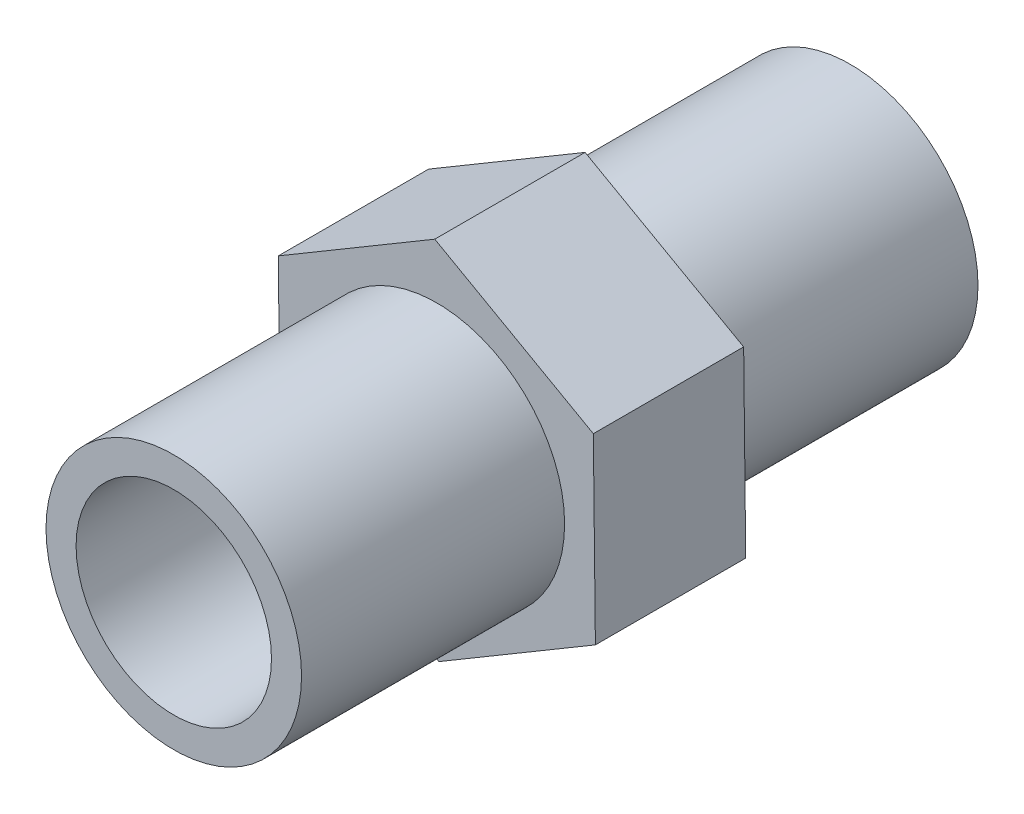
ISO-10303-21;
HEADER;
FILE_DESCRIPTION(('STEP AP214'),'2;1');
FILE_NAME('part.step','',(''),(''),'','','');
FILE_SCHEMA(('AUTOMOTIVE_DESIGN { 1 0 10303 214 1 1 1 1 }'));
ENDSEC;
DATA;
#1=APPLICATION_CONTEXT('core data for automotive mechanical design processes');
#2=APPLICATION_PROTOCOL_DEFINITION('international standard','automotive_design',2000,#1);
#3=PRODUCT_CONTEXT('',#1,'mechanical');
#4=PRODUCT('Part','Part','',(#3));
#5=PRODUCT_RELATED_PRODUCT_CATEGORY('part','',(#4));
#6=PRODUCT_DEFINITION_FORMATION('','',#4);
#7=PRODUCT_DEFINITION_CONTEXT('part definition',#1,'design');
#8=PRODUCT_DEFINITION('design','',#6,#7);
#9=PRODUCT_DEFINITION_SHAPE('','',#8);
#10=(LENGTH_UNIT() NAMED_UNIT(*) SI_UNIT(.MILLI.,.METRE.));
#11=(NAMED_UNIT(*) PLANE_ANGLE_UNIT() SI_UNIT($,.RADIAN.));
#12=(NAMED_UNIT(*) SI_UNIT($,.STERADIAN.) SOLID_ANGLE_UNIT());
#13=UNCERTAINTY_MEASURE_WITH_UNIT(LENGTH_MEASURE(1.E-05),#10,'distance_accuracy_value','');
#14=(GEOMETRIC_REPRESENTATION_CONTEXT(3) GLOBAL_UNCERTAINTY_ASSIGNED_CONTEXT((#13)) GLOBAL_UNIT_ASSIGNED_CONTEXT((#10,
#11,#12)) REPRESENTATION_CONTEXT('',''));
#15=CARTESIAN_POINT('',(0.,0.,0.));
#16=DIRECTION('',(0.,0.,1.));
#17=DIRECTION('',(1.,0.,0.));
#18=AXIS2_PLACEMENT_3D('',#15,#16,#17);
#19=CARTESIAN_POINT('',(-8.88178419700125E-13,0.,22.5));
#20=DIRECTION('',(0.,0.,1.));
#21=DIRECTION('',(1.,0.,0.));
#22=AXIS2_PLACEMENT_3D('',#19,#20,#21);
#23=PLANE('',#22);
#24=CARTESIAN_POINT('',(-8.88178419700125E-13,0.,22.5));
#25=DIRECTION('',(0.,0.,1.));
#26=DIRECTION('',(1.,0.,0.));
#27=AXIS2_PLACEMENT_3D('',#24,#25,#26);
#28=CIRCLE('',#27,8.5);
#29=CARTESIAN_POINT('',(-8.50000000000089,0.,22.5));
#30=VERTEX_POINT('',#29);
#31=EDGE_CURVE('E155',#30,#30,#28,.T.);
#32=ORIENTED_EDGE('',*,*,#31,.T.);
#33=EDGE_LOOP('',(#32));
#34=FACE_BOUND('',#33,.T.);
#35=CARTESIAN_POINT('',(-8.88178419700125E-13,0.,22.5));
#36=DIRECTION('',(0.,0.,1.));
#37=DIRECTION('',(1.,0.,0.));
#38=AXIS2_PLACEMENT_3D('',#35,#36,#37);
#39=CIRCLE('',#38,6.5);
#40=CARTESIAN_POINT('',(-6.50000000000089,0.,22.5));
#41=VERTEX_POINT('',#40);
#42=EDGE_CURVE('E149',#41,#41,#39,.T.);
#43=ORIENTED_EDGE('',*,*,#42,.F.);
#44=EDGE_LOOP('',(#43));
#45=FACE_BOUND('',#44,.T.);
#46=ADVANCED_FACE('F38',(#34,#45),#23,.T.);
#47=CARTESIAN_POINT('',(-8.88178419700125E-13,0.,22.5));
#48=DIRECTION('',(0.,0.,-1.));
#49=DIRECTION('',(-1.,0.,0.));
#50=AXIS2_PLACEMENT_3D('',#47,#48,#49);
#51=CYLINDRICAL_SURFACE('',#50,8.5);
#52=CARTESIAN_POINT('',(8.88178419700125E-13,0.,4.99999999999989));
#53=DIRECTION('',(0.,0.,1.));
#54=DIRECTION('',(1.,0.,0.));
#55=AXIS2_PLACEMENT_3D('',#52,#53,#54);
#56=CIRCLE('',#55,8.5);
#57=CARTESIAN_POINT('',(-8.50000000000089,0.,4.99999999999989));
#58=VERTEX_POINT('',#57);
#59=EDGE_CURVE('E145',#58,#58,#56,.T.);
#60=CARTESIAN_POINT('',(-8.50000000000089,0.,4.99999999999989));
#61=CARTESIAN_POINT('',(-8.50000000000089,0.,5.18229166666656));
#62=CARTESIAN_POINT('',(-8.50000000000089,0.,5.36458333333322));
#63=CARTESIAN_POINT('',(-8.50000000000089,0.,5.72916666666656));
#64=CARTESIAN_POINT('',(-8.50000000000089,0.,5.91145833333323));
#65=CARTESIAN_POINT('',(-8.50000000000089,0.,6.27604166666656));
#66=CARTESIAN_POINT('',(-8.50000000000089,0.,6.45833333333323));
#67=CARTESIAN_POINT('',(-8.50000000000089,0.,6.82291666666656));
#68=CARTESIAN_POINT('',(-8.50000000000089,0.,7.00520833333323));
#69=CARTESIAN_POINT('',(-8.50000000000089,0.,7.36979166666656));
#70=CARTESIAN_POINT('',(-8.50000000000089,0.,7.55208333333323));
#71=CARTESIAN_POINT('',(-8.50000000000089,0.,7.91666666666657));
#72=CARTESIAN_POINT('',(-8.50000000000089,0.,8.09895833333324));
#73=CARTESIAN_POINT('',(-8.50000000000089,0.,8.46354166666657));
#74=CARTESIAN_POINT('',(-8.50000000000089,0.,8.64583333333324));
#75=CARTESIAN_POINT('',(-8.50000000000089,0.,9.01041666666657));
#76=CARTESIAN_POINT('',(-8.50000000000089,0.,9.19270833333324));
#77=CARTESIAN_POINT('',(-8.50000000000089,0.,9.55729166666658));
#78=CARTESIAN_POINT('',(-8.50000000000089,0.,9.73958333333324));
#79=CARTESIAN_POINT('',(-8.50000000000089,0.,10.1041666666666));
#80=CARTESIAN_POINT('',(-8.50000000000089,0.,10.2864583333332));
#81=CARTESIAN_POINT('',(-8.50000000000089,0.,10.6510416666666));
#82=CARTESIAN_POINT('',(-8.50000000000089,0.,10.8333333333332));
#83=CARTESIAN_POINT('',(-8.50000000000089,0.,11.1979166666666));
#84=CARTESIAN_POINT('',(-8.50000000000089,0.,11.3802083333333));
#85=CARTESIAN_POINT('',(-8.50000000000089,0.,11.7447916666666));
#86=CARTESIAN_POINT('',(-8.50000000000089,0.,11.9270833333333));
#87=CARTESIAN_POINT('',(-8.50000000000089,0.,12.2916666666666));
#88=CARTESIAN_POINT('',(-8.50000000000089,0.,12.4739583333333));
#89=CARTESIAN_POINT('',(-8.50000000000089,0.,12.8385416666666));
#90=CARTESIAN_POINT('',(-8.50000000000089,0.,13.0208333333333));
#91=CARTESIAN_POINT('',(-8.50000000000089,0.,13.3854166666666));
#92=CARTESIAN_POINT('',(-8.50000000000089,0.,13.5677083333333));
#93=CARTESIAN_POINT('',(-8.50000000000089,0.,13.9322916666666));
#94=CARTESIAN_POINT('',(-8.50000000000089,0.,14.1145833333333));
#95=CARTESIAN_POINT('',(-8.50000000000089,0.,14.4791666666666));
#96=CARTESIAN_POINT('',(-8.50000000000089,0.,14.6614583333333));
#97=CARTESIAN_POINT('',(-8.50000000000089,0.,15.0260416666666));
#98=CARTESIAN_POINT('',(-8.50000000000089,0.,15.2083333333333));
#99=CARTESIAN_POINT('',(-8.50000000000089,0.,15.5729166666666));
#100=CARTESIAN_POINT('',(-8.50000000000089,0.,15.7552083333333));
#101=CARTESIAN_POINT('',(-8.50000000000089,0.,16.1197916666666));
#102=CARTESIAN_POINT('',(-8.50000000000089,0.,16.3020833333333));
#103=CARTESIAN_POINT('',(-8.50000000000089,0.,16.6666666666666));
#104=CARTESIAN_POINT('',(-8.50000000000089,0.,16.8489583333333));
#105=CARTESIAN_POINT('',(-8.50000000000089,0.,17.2135416666666));
#106=CARTESIAN_POINT('',(-8.50000000000089,0.,17.3958333333333));
#107=CARTESIAN_POINT('',(-8.50000000000089,0.,17.7604166666666));
#108=CARTESIAN_POINT('',(-8.50000000000089,0.,17.9427083333333));
#109=CARTESIAN_POINT('',(-8.50000000000089,0.,18.3072916666666));
#110=CARTESIAN_POINT('',(-8.50000000000089,0.,18.4895833333333));
#111=CARTESIAN_POINT('',(-8.50000000000089,0.,18.8541666666666));
#112=CARTESIAN_POINT('',(-8.50000000000089,0.,19.0364583333333));
#113=CARTESIAN_POINT('',(-8.50000000000089,0.,19.4010416666666));
#114=CARTESIAN_POINT('',(-8.50000000000089,0.,19.5833333333333));
#115=CARTESIAN_POINT('',(-8.50000000000089,0.,19.9479166666666));
#116=CARTESIAN_POINT('',(-8.50000000000089,0.,20.1302083333333));
#117=CARTESIAN_POINT('',(-8.50000000000089,0.,20.4947916666666));
#118=CARTESIAN_POINT('',(-8.50000000000089,0.,20.6770833333333));
#119=CARTESIAN_POINT('',(-8.50000000000089,0.,21.0416666666666));
#120=CARTESIAN_POINT('',(-8.50000000000089,0.,21.2239583333333));
#121=CARTESIAN_POINT('',(-8.50000000000089,0.,21.5885416666666));
#122=CARTESIAN_POINT('',(-8.50000000000089,0.,21.7708333333333));
#123=CARTESIAN_POINT('',(-8.50000000000089,0.,22.1354166666666));
#124=CARTESIAN_POINT('',(-8.50000000000089,0.,22.3177083333333));
#125=CARTESIAN_POINT('',(-8.50000000000089,0.,22.5));
#126=B_SPLINE_CURVE_WITH_KNOTS('',3,(#60,#61,#62,#63,#64,#65,#66,#67,#68,#69,#70,#71,#72,#73,
#74,#75,#76,#77,#78,#79,#80,#81,#82,#83,#84,#85,#86,#87,#88,#89,#90,#91,#92,#93,#94,#95,#96,#97,
#98,#99,#100,#101,#102,#103,#104,#105,#106,#107,#108,#109,#110,#111,#112,#113,#114,#115,#116,
#117,#118,#119,#120,#121,#122,#123,#124,#125),.UNSPECIFIED.,.F.,.F.,(4,2,2,2,2,2,2,2,2,2,2,2,2,
2,2,2,2,2,2,2,2,2,2,2,2,2,2,2,2,2,2,2,4),(0.,0.546875000000002,1.09375,1.64062500000001,
2.18750000000001,2.73437500000001,3.28125000000001,3.82812500000002,4.37500000000002,
4.92187500000002,5.46875000000002,6.01562500000003,6.56250000000003,7.10937500000003,
7.65625000000003,8.20312500000004,8.75000000000004,9.29687500000004,9.84375000000004,10.390625,
10.9375,11.484375,12.0312500000001,12.5781250000001,13.1250000000001,13.6718750000001,
14.2187500000001,14.7656250000001,15.3125000000001,15.8593750000001,16.4062500000001,
16.9531250000001,17.5000000000001),.UNSPECIFIED.);
#127=EDGE_CURVE('BSEAM40',#58,#30,#126,.T.);
#128=ORIENTED_EDGE('',*,*,#59,.T.);
#129=ORIENTED_EDGE('',*,*,#31,.F.);
#130=ORIENTED_EDGE('',*,*,#127,.T.);
#131=ORIENTED_EDGE('',*,*,#127,.F.);
#132=EDGE_LOOP('',(#128,#130,#129,#131));
#133=FACE_BOUND('',#132,.T.);
#134=ADVANCED_FACE('F40',(#133),#51,.T.);
#135=CARTESIAN_POINT('',(-8.88178419700125E-13,0.,22.5));
#136=DIRECTION('',(0.,0.,-1.));
#137=DIRECTION('',(-1.,0.,0.));
#138=AXIS2_PLACEMENT_3D('',#135,#136,#137);
#139=CYLINDRICAL_SURFACE('',#138,6.5);
#140=CARTESIAN_POINT('',(8.88178419700125E-13,0.,4.99999999999989));
#141=DIRECTION('',(0.,0.,1.));
#142=DIRECTION('',(1.,0.,0.));
#143=AXIS2_PLACEMENT_3D('',#140,#141,#142);
#144=CIRCLE('',#143,6.5);
#145=CARTESIAN_POINT('',(-6.50000000000089,0.,4.99999999999989));
#146=VERTEX_POINT('',#145);
#147=EDGE_CURVE('E42',#146,#146,#144,.T.);
#148=CARTESIAN_POINT('',(-6.50000000000089,0.,4.99999999999989));
#149=CARTESIAN_POINT('',(-6.50000000000089,0.,5.18229166666656));
#150=CARTESIAN_POINT('',(-6.50000000000089,0.,5.36458333333322));
#151=CARTESIAN_POINT('',(-6.50000000000089,0.,5.72916666666656));
#152=CARTESIAN_POINT('',(-6.50000000000089,0.,5.91145833333323));
#153=CARTESIAN_POINT('',(-6.50000000000089,0.,6.27604166666656));
#154=CARTESIAN_POINT('',(-6.50000000000089,0.,6.45833333333323));
#155=CARTESIAN_POINT('',(-6.50000000000089,0.,6.82291666666656));
#156=CARTESIAN_POINT('',(-6.50000000000089,0.,7.00520833333323));
#157=CARTESIAN_POINT('',(-6.50000000000089,0.,7.36979166666656));
#158=CARTESIAN_POINT('',(-6.50000000000089,0.,7.55208333333323));
#159=CARTESIAN_POINT('',(-6.50000000000089,0.,7.91666666666657));
#160=CARTESIAN_POINT('',(-6.50000000000089,0.,8.09895833333324));
#161=CARTESIAN_POINT('',(-6.50000000000089,0.,8.46354166666657));
#162=CARTESIAN_POINT('',(-6.50000000000089,0.,8.64583333333324));
#163=CARTESIAN_POINT('',(-6.50000000000089,0.,9.01041666666657));
#164=CARTESIAN_POINT('',(-6.50000000000089,0.,9.19270833333324));
#165=CARTESIAN_POINT('',(-6.50000000000089,0.,9.55729166666658));
#166=CARTESIAN_POINT('',(-6.50000000000089,0.,9.73958333333324));
#167=CARTESIAN_POINT('',(-6.50000000000089,0.,10.1041666666666));
#168=CARTESIAN_POINT('',(-6.50000000000089,0.,10.2864583333332));
#169=CARTESIAN_POINT('',(-6.50000000000089,0.,10.6510416666666));
#170=CARTESIAN_POINT('',(-6.50000000000089,0.,10.8333333333332));
#171=CARTESIAN_POINT('',(-6.50000000000089,0.,11.1979166666666));
#172=CARTESIAN_POINT('',(-6.50000000000089,0.,11.3802083333333));
#173=CARTESIAN_POINT('',(-6.50000000000089,0.,11.7447916666666));
#174=CARTESIAN_POINT('',(-6.50000000000089,0.,11.9270833333333));
#175=CARTESIAN_POINT('',(-6.50000000000089,0.,12.2916666666666));
#176=CARTESIAN_POINT('',(-6.50000000000089,0.,12.4739583333333));
#177=CARTESIAN_POINT('',(-6.50000000000089,0.,12.8385416666666));
#178=CARTESIAN_POINT('',(-6.50000000000089,0.,13.0208333333333));
#179=CARTESIAN_POINT('',(-6.50000000000089,0.,13.3854166666666));
#180=CARTESIAN_POINT('',(-6.50000000000089,0.,13.5677083333333));
#181=CARTESIAN_POINT('',(-6.50000000000089,0.,13.9322916666666));
#182=CARTESIAN_POINT('',(-6.50000000000089,0.,14.1145833333333));
#183=CARTESIAN_POINT('',(-6.50000000000089,0.,14.4791666666666));
#184=CARTESIAN_POINT('',(-6.50000000000089,0.,14.6614583333333));
#185=CARTESIAN_POINT('',(-6.50000000000089,0.,15.0260416666666));
#186=CARTESIAN_POINT('',(-6.50000000000089,0.,15.2083333333333));
#187=CARTESIAN_POINT('',(-6.50000000000089,0.,15.5729166666666));
#188=CARTESIAN_POINT('',(-6.50000000000089,0.,15.7552083333333));
#189=CARTESIAN_POINT('',(-6.50000000000089,0.,16.1197916666666));
#190=CARTESIAN_POINT('',(-6.50000000000089,0.,16.3020833333333));
#191=CARTESIAN_POINT('',(-6.50000000000089,0.,16.6666666666666));
#192=CARTESIAN_POINT('',(-6.50000000000089,0.,16.8489583333333));
#193=CARTESIAN_POINT('',(-6.50000000000089,0.,17.2135416666666));
#194=CARTESIAN_POINT('',(-6.50000000000089,0.,17.3958333333333));
#195=CARTESIAN_POINT('',(-6.50000000000089,0.,17.7604166666666));
#196=CARTESIAN_POINT('',(-6.50000000000089,0.,17.9427083333333));
#197=CARTESIAN_POINT('',(-6.50000000000089,0.,18.3072916666666));
#198=CARTESIAN_POINT('',(-6.50000000000089,0.,18.4895833333333));
#199=CARTESIAN_POINT('',(-6.50000000000089,0.,18.8541666666666));
#200=CARTESIAN_POINT('',(-6.50000000000089,0.,19.0364583333333));
#201=CARTESIAN_POINT('',(-6.50000000000089,0.,19.4010416666666));
#202=CARTESIAN_POINT('',(-6.50000000000089,0.,19.5833333333333));
#203=CARTESIAN_POINT('',(-6.50000000000089,0.,19.9479166666666));
#204=CARTESIAN_POINT('',(-6.50000000000089,0.,20.1302083333333));
#205=CARTESIAN_POINT('',(-6.50000000000089,0.,20.4947916666666));
#206=CARTESIAN_POINT('',(-6.50000000000089,0.,20.6770833333333));
#207=CARTESIAN_POINT('',(-6.50000000000089,0.,21.0416666666666));
#208=CARTESIAN_POINT('',(-6.50000000000089,0.,21.2239583333333));
#209=CARTESIAN_POINT('',(-6.50000000000089,0.,21.5885416666666));
#210=CARTESIAN_POINT('',(-6.50000000000089,0.,21.7708333333333));
#211=CARTESIAN_POINT('',(-6.50000000000089,0.,22.1354166666666));
#212=CARTESIAN_POINT('',(-6.50000000000089,0.,22.3177083333333));
#213=CARTESIAN_POINT('',(-6.50000000000089,0.,22.5));
#214=B_SPLINE_CURVE_WITH_KNOTS('',3,(#148,#149,#150,#151,#152,#153,#154,#155,#156,#157,#158,
#159,#160,#161,#162,#163,#164,#165,#166,#167,#168,#169,#170,#171,#172,#173,#174,#175,#176,#177,
#178,#179,#180,#181,#182,#183,#184,#185,#186,#187,#188,#189,#190,#191,#192,#193,#194,#195,#196,
#197,#198,#199,#200,#201,#202,#203,#204,#205,#206,#207,#208,#209,#210,#211,#212,#213),
.UNSPECIFIED.,.F.,.F.,(4,2,2,2,2,2,2,2,2,2,2,2,2,2,2,2,2,2,2,2,2,2,2,2,2,2,2,2,2,2,2,2,4),(0.,
0.546875000000002,1.09375,1.64062500000001,2.18750000000001,2.73437500000001,3.28125000000001,
3.82812500000002,4.37500000000002,4.92187500000002,5.46875000000002,6.01562500000003,
6.56250000000003,7.10937500000003,7.65625000000003,8.20312500000004,8.75000000000004,
9.29687500000004,9.84375000000004,10.390625,10.9375,11.484375,12.0312500000001,12.5781250000001,
13.1250000000001,13.6718750000001,14.2187500000001,14.7656250000001,15.3125000000001,
15.8593750000001,16.4062500000001,16.9531250000001,17.5000000000001),.UNSPECIFIED.);
#215=EDGE_CURVE('BSEAM174',#146,#41,#214,.T.);
#216=ORIENTED_EDGE('',*,*,#147,.F.);
#217=ORIENTED_EDGE('',*,*,#42,.T.);
#218=ORIENTED_EDGE('',*,*,#215,.T.);
#219=ORIENTED_EDGE('',*,*,#215,.F.);
#220=EDGE_LOOP('',(#216,#218,#217,#219));
#221=FACE_BOUND('',#220,.T.);
#222=ADVANCED_FACE('F174',(#221),#139,.F.);
#223=CARTESIAN_POINT('',(8.88178419700125E-13,0.,4.99999999999989));
#224=DIRECTION('',(0.,0.,1.));
#225=DIRECTION('',(1.,0.,0.));
#226=AXIS2_PLACEMENT_3D('',#223,#224,#225);
#227=PLANE('',#226);
#228=ORIENTED_EDGE('',*,*,#147,.T.);
#229=EDGE_LOOP('',(#228));
#230=FACE_BOUND('',#229,.T.);
#231=ADVANCED_FACE('F214',(#230),#227,.T.);
#232=CARTESIAN_POINT('',(10.5475883351422,-5.93199806031164,4.99999999999989));
#233=DIRECTION('',(-0.999936349812819,-0.0112825672174558,0.));
#234=DIRECTION('',(0.0112825672174556,-0.999936349812819,0.));
#235=AXIS2_PLACEMENT_3D('',#232,#233,#234);
#236=PLANE('',#235);
#237=DIRECTION('',(-0.0112825672174556,0.999936349812819,0.));
#238=VECTOR('',#237,1.);
#239=CARTESIAN_POINT('',(10.5475883351431,-5.93199806031161,-5.));
#240=LINE('',#239,#238);
#241=CARTESIAN_POINT('',(10.5475883351431,-5.93199806031161,-5.));
#242=VERTEX_POINT('',#241);
#243=CARTESIAN_POINT('',(10.4110551830017,6.16848041673723,-5.00000000000067));
#244=VERTEX_POINT('',#243);
#245=EDGE_CURVE('E125',#242,#244,#240,.T.);
#246=ORIENTED_EDGE('',*,*,#245,.T.);
#247=DIRECTION('',(0.,0.,-1.));
#248=VECTOR('',#247,1.);
#249=CARTESIAN_POINT('',(10.4110551830008,6.16848041673815,4.99999999999989));
#250=LINE('',#249,#248);
#251=CARTESIAN_POINT('',(10.4110551830008,6.16848041673815,4.99999999999989));
#252=VERTEX_POINT('',#251);
#253=EDGE_CURVE('E142',#252,#244,#250,.T.);
#254=ORIENTED_EDGE('',*,*,#253,.F.);
#255=DIRECTION('',(-0.0112825672174556,0.999936349812819,0.));
#256=VECTOR('',#255,1.);
#257=CARTESIAN_POINT('',(10.5475883351422,-5.93199806031164,4.99999999999989));
#258=LINE('',#257,#256);
#259=CARTESIAN_POINT('',(10.5475883351422,-5.93199806031164,4.99999999999989));
#260=VERTEX_POINT('',#259);
#261=EDGE_CURVE('E135',#260,#252,#258,.T.);
#262=ORIENTED_EDGE('',*,*,#261,.F.);
#263=DIRECTION('',(0.,0.,-1.));
#264=VECTOR('',#263,1.);
#265=CARTESIAN_POINT('',(10.5475883351422,-5.93199806031164,4.99999999999989));
#266=LINE('',#265,#264);
#267=EDGE_CURVE('E121',#260,#242,#266,.T.);
#268=ORIENTED_EDGE('',*,*,#267,.T.);
#269=EDGE_LOOP('',(#246,#254,#262,#268));
#270=FACE_BOUND('',#269,.T.);
#271=ADVANCED_FACE('F205',(#270),#236,.F.);
#272=CARTESIAN_POINT('',(10.4110551830008,6.16848041673815,4.99999999999989));
#273=DIRECTION('',(-0.490197185076187,-0.871611564714112,0.));
#274=DIRECTION('',(0.871611564714112,-0.490197185076188,0.));
#275=AXIS2_PLACEMENT_3D('',#272,#273,#274);
#276=PLANE('',#275);
#277=DIRECTION('',(-0.871611564714112,0.490197185076188,0.));
#278=VECTOR('',#277,1.);
#279=CARTESIAN_POINT('',(10.4110551830017,6.16848041673723,-5.00000000000067));
#280=LINE('',#279,#278);
#281=CARTESIAN_POINT('',(-0.136533152140572,12.1004784770489,-5.00000000000078));
#282=VERTEX_POINT('',#281);
#283=EDGE_CURVE('E128',#244,#282,#280,.T.);
#284=ORIENTED_EDGE('',*,*,#283,.T.);
#285=DIRECTION('',(0.,0.,-1.));
#286=VECTOR('',#285,1.);
#287=CARTESIAN_POINT('',(-0.13653315214146,12.1004784770489,4.99999999999989));
#288=LINE('',#287,#286);
#289=CARTESIAN_POINT('',(-0.13653315214146,12.1004784770489,4.99999999999989));
#290=VERTEX_POINT('',#289);
#291=EDGE_CURVE('E139',#290,#282,#288,.T.);
#292=ORIENTED_EDGE('',*,*,#291,.F.);
#293=DIRECTION('',(-0.871611564714112,0.490197185076188,0.));
#294=VECTOR('',#293,1.);
#295=CARTESIAN_POINT('',(10.4110551830008,6.16848041673815,4.99999999999989));
#296=LINE('',#295,#294);
#297=EDGE_CURVE('E94',#252,#290,#296,.T.);
#298=ORIENTED_EDGE('',*,*,#297,.F.);
#299=ORIENTED_EDGE('',*,*,#253,.T.);
#300=EDGE_LOOP('',(#284,#292,#298,#299));
#301=FACE_BOUND('',#300,.T.);
#302=ADVANCED_FACE('F222',(#301),#276,.F.);
#303=CARTESIAN_POINT('',(-0.13653315214146,12.1004784770489,4.99999999999989));
#304=DIRECTION('',(0.509739164736631,-0.860328997496657,0.));
#305=DIRECTION('',(0.860328997496656,0.509739164736632,0.));
#306=AXIS2_PLACEMENT_3D('',#303,#304,#305);
#307=PLANE('',#306);
#308=DIRECTION('',(-0.860328997496656,-0.509739164736632,0.));
#309=VECTOR('',#308,1.);
#310=CARTESIAN_POINT('',(-0.136533152140572,12.1004784770489,-5.00000000000078));
#311=LINE('',#310,#309);
#312=CARTESIAN_POINT('',(-10.5475883351431,5.93199806031164,-5.));
#313=VERTEX_POINT('',#312);
#314=EDGE_CURVE('E130',#282,#313,#311,.T.);
#315=ORIENTED_EDGE('',*,*,#314,.T.);
#316=DIRECTION('',(0.,0.,-1.));
#317=VECTOR('',#316,1.);
#318=CARTESIAN_POINT('',(-10.5475883351431,5.93199806031167,4.99999999999978));
#319=LINE('',#318,#317);
#320=CARTESIAN_POINT('',(-10.5475883351431,5.93199806031167,4.99999999999978));
#321=VERTEX_POINT('',#320);
#322=EDGE_CURVE('E116',#321,#313,#319,.T.);
#323=ORIENTED_EDGE('',*,*,#322,.F.);
#324=DIRECTION('',(-0.860328997496656,-0.509739164736632,0.));
#325=VECTOR('',#324,1.);
#326=CARTESIAN_POINT('',(-0.13653315214146,12.1004784770489,4.99999999999989));
#327=LINE('',#326,#325);
#328=EDGE_CURVE('E107',#290,#321,#327,.T.);
#329=ORIENTED_EDGE('',*,*,#328,.F.);
#330=ORIENTED_EDGE('',*,*,#291,.T.);
#331=EDGE_LOOP('',(#315,#323,#329,#330));
#332=FACE_BOUND('',#331,.T.);
#333=ADVANCED_FACE('F219',(#332),#307,.F.);
#334=CARTESIAN_POINT('',(-10.5475883351431,5.93199806031167,4.99999999999978));
#335=DIRECTION('',(0.999936349812819,0.0112825672174558,0.));
#336=DIRECTION('',(-0.0112825672174558,0.999936349812819,0.));
#337=AXIS2_PLACEMENT_3D('',#334,#335,#336);
#338=PLANE('',#337);
#339=DIRECTION('',(0.0112825672174558,-0.999936349812819,0.));
#340=VECTOR('',#339,1.);
#341=CARTESIAN_POINT('',(-10.5475883351431,5.93199806031164,-5.));
#342=LINE('',#341,#340);
#343=CARTESIAN_POINT('',(-10.4110551830017,-6.16848041673815,-5.00000000000078));
#344=VERTEX_POINT('',#343);
#345=EDGE_CURVE('E115',#313,#344,#342,.T.);
#346=ORIENTED_EDGE('',*,*,#345,.T.);
#347=DIRECTION('',(0.,0.,-1.));
#348=VECTOR('',#347,1.);
#349=CARTESIAN_POINT('',(-10.4110551830008,-6.16848041673818,4.99999999999901));
#350=LINE('',#349,#348);
#351=CARTESIAN_POINT('',(-10.4110551830008,-6.16848041673818,4.99999999999901));
#352=VERTEX_POINT('',#351);
#353=EDGE_CURVE('E112',#352,#344,#350,.T.);
#354=ORIENTED_EDGE('',*,*,#353,.F.);
#355=DIRECTION('',(0.0112825672174558,-0.999936349812819,0.));
#356=VECTOR('',#355,1.);
#357=CARTESIAN_POINT('',(-10.5475883351431,5.93199806031167,4.99999999999978));
#358=LINE('',#357,#356);
#359=EDGE_CURVE('E101',#321,#352,#358,.T.);
#360=ORIENTED_EDGE('',*,*,#359,.F.);
#361=ORIENTED_EDGE('',*,*,#322,.T.);
#362=EDGE_LOOP('',(#346,#354,#360,#361));
#363=FACE_BOUND('',#362,.T.);
#364=ADVANCED_FACE('F113',(#363),#338,.F.);
#365=CARTESIAN_POINT('',(-10.4110551830008,-6.16848041673818,4.99999999999901));
#366=DIRECTION('',(0.490197185076187,0.871611564714112,0.));
#367=DIRECTION('',(-0.871611564714112,0.490197185076187,0.));
#368=AXIS2_PLACEMENT_3D('',#365,#366,#367);
#369=PLANE('',#368);
#370=DIRECTION('',(0.871611564714112,-0.490197185076187,0.));
#371=VECTOR('',#370,1.);
#372=CARTESIAN_POINT('',(-10.4110551830017,-6.16848041673815,-5.00000000000078));
#373=LINE('',#372,#371);
#374=CARTESIAN_POINT('',(0.136533152142349,-12.1004784770493,-4.99999999999989));
#375=VERTEX_POINT('',#374);
#376=EDGE_CURVE('E79',#344,#375,#373,.T.);
#377=ORIENTED_EDGE('',*,*,#376,.T.);
#378=DIRECTION('',(0.,0.,-1.));
#379=VECTOR('',#378,1.);
#380=CARTESIAN_POINT('',(0.136533152140572,-12.1004784770489,4.99999999999989));
#381=LINE('',#380,#379);
#382=CARTESIAN_POINT('',(0.136533152140572,-12.1004784770489,4.99999999999989));
#383=VERTEX_POINT('',#382);
#384=EDGE_CURVE('E117',#383,#375,#381,.T.);
#385=ORIENTED_EDGE('',*,*,#384,.F.);
#386=DIRECTION('',(0.871611564714112,-0.490197185076187,0.));
#387=VECTOR('',#386,1.);
#388=CARTESIAN_POINT('',(-10.4110551830008,-6.16848041673818,4.99999999999901));
#389=LINE('',#388,#387);
#390=EDGE_CURVE('E105',#352,#383,#389,.T.);
#391=ORIENTED_EDGE('',*,*,#390,.F.);
#392=ORIENTED_EDGE('',*,*,#353,.T.);
#393=EDGE_LOOP('',(#377,#385,#391,#392));
#394=FACE_BOUND('',#393,.T.);
#395=ADVANCED_FACE('F119',(#394),#369,.F.);
#396=CARTESIAN_POINT('',(0.136533152140572,-12.1004784770489,4.99999999999989));
#397=DIRECTION('',(-0.509739164736632,0.860328997496657,0.));
#398=DIRECTION('',(-0.860328997496656,-0.509739164736632,0.));
#399=AXIS2_PLACEMENT_3D('',#396,#397,#398);
#400=PLANE('',#399);
#401=DIRECTION('',(0.860328997496656,0.509739164736632,0.));
#402=VECTOR('',#401,1.);
#403=CARTESIAN_POINT('',(0.136533152142349,-12.1004784770493,-4.99999999999989));
#404=LINE('',#403,#402);
#405=EDGE_CURVE('E85',#375,#242,#404,.T.);
#406=ORIENTED_EDGE('',*,*,#405,.T.);
#407=ORIENTED_EDGE('',*,*,#267,.F.);
#408=DIRECTION('',(0.860328997496656,0.509739164736632,0.));
#409=VECTOR('',#408,1.);
#410=CARTESIAN_POINT('',(0.136533152140572,-12.1004784770489,4.99999999999989));
#411=LINE('',#410,#409);
#412=EDGE_CURVE('E56',#383,#260,#411,.T.);
#413=ORIENTED_EDGE('',*,*,#412,.F.);
#414=ORIENTED_EDGE('',*,*,#384,.T.);
#415=EDGE_LOOP('',(#406,#407,#413,#414));
#416=FACE_BOUND('',#415,.T.);
#417=ADVANCED_FACE('F207',(#416),#400,.F.);
#418=ORIENTED_EDGE('',*,*,#59,.F.);
#419=EDGE_LOOP('',(#418));
#420=FACE_BOUND('',#419,.T.);
#421=ORIENTED_EDGE('',*,*,#261,.T.);
#422=ORIENTED_EDGE('',*,*,#297,.T.);
#423=ORIENTED_EDGE('',*,*,#328,.T.);
#424=ORIENTED_EDGE('',*,*,#359,.T.);
#425=ORIENTED_EDGE('',*,*,#390,.T.);
#426=ORIENTED_EDGE('',*,*,#412,.T.);
#427=EDGE_LOOP('',(#421,#422,#423,#424,#425,#426));
#428=FACE_BOUND('',#427,.T.);
#429=ADVANCED_FACE('F103',(#420,#428),#227,.T.);
#430=CARTESIAN_POINT('',(0.,0.,-5.00000000000078));
#431=DIRECTION('',(0.,0.,1.));
#432=DIRECTION('',(1.,0.,0.));
#433=AXIS2_PLACEMENT_3D('',#430,#431,#432);
#434=PLANE('',#433);
#435=CARTESIAN_POINT('',(0.,0.,-5.00000000000078));
#436=DIRECTION('',(0.,0.,1.));
#437=DIRECTION('',(1.,0.,0.));
#438=AXIS2_PLACEMENT_3D('',#435,#436,#437);
#439=CIRCLE('',#438,8.5);
#440=CARTESIAN_POINT('',(-8.50000000000089,0.,-5.00000000000079));
#441=VERTEX_POINT('',#440);
#442=EDGE_CURVE('E12',#441,#441,#439,.T.);
#443=ORIENTED_EDGE('',*,*,#442,.T.);
#444=EDGE_LOOP('',(#443));
#445=FACE_BOUND('',#444,.T.);
#446=ORIENTED_EDGE('',*,*,#245,.F.);
#447=ORIENTED_EDGE('',*,*,#405,.F.);
#448=ORIENTED_EDGE('',*,*,#376,.F.);
#449=ORIENTED_EDGE('',*,*,#345,.F.);
#450=ORIENTED_EDGE('',*,*,#314,.F.);
#451=ORIENTED_EDGE('',*,*,#283,.F.);
#452=EDGE_LOOP('',(#446,#447,#448,#449,#450,#451));
#453=FACE_BOUND('',#452,.T.);
#454=ADVANCED_FACE('F167',(#445,#453),#434,.F.);
#455=CARTESIAN_POINT('',(8.88178419700125E-13,0.,-22.5000000000009));
#456=DIRECTION('',(0.,0.,1.));
#457=DIRECTION('',(1.,0.,0.));
#458=AXIS2_PLACEMENT_3D('',#455,#456,#457);
#459=CIRCLE('',#458,8.5);
#460=CARTESIAN_POINT('',(-8.50000000000089,0.,-22.5000000000009));
#461=VERTEX_POINT('',#460);
#462=EDGE_CURVE('E152',#461,#461,#459,.T.);
#463=CARTESIAN_POINT('',(-8.50000000000089,0.,-22.5000000000009));
#464=CARTESIAN_POINT('',(-8.50000000000089,0.,-22.3177083333342));
#465=CARTESIAN_POINT('',(-8.50000000000089,0.,-22.1354166666675));
#466=CARTESIAN_POINT('',(-8.50000000000089,0.,-21.7708333333342));
#467=CARTESIAN_POINT('',(-8.50000000000089,0.,-21.5885416666675));
#468=CARTESIAN_POINT('',(-8.50000000000089,0.,-21.2239583333342));
#469=CARTESIAN_POINT('',(-8.50000000000089,0.,-21.0416666666675));
#470=CARTESIAN_POINT('',(-8.50000000000089,0.,-20.6770833333342));
#471=CARTESIAN_POINT('',(-8.50000000000089,0.,-20.4947916666675));
#472=CARTESIAN_POINT('',(-8.50000000000089,0.,-20.1302083333342));
#473=CARTESIAN_POINT('',(-8.50000000000089,0.,-19.9479166666675));
#474=CARTESIAN_POINT('',(-8.50000000000089,0.,-19.5833333333342));
#475=CARTESIAN_POINT('',(-8.50000000000089,0.,-19.4010416666675));
#476=CARTESIAN_POINT('',(-8.50000000000089,0.,-19.0364583333342));
#477=CARTESIAN_POINT('',(-8.50000000000089,0.,-18.8541666666675));
#478=CARTESIAN_POINT('',(-8.50000000000089,0.,-18.4895833333342));
#479=CARTESIAN_POINT('',(-8.50000000000089,0.,-18.3072916666675));
#480=CARTESIAN_POINT('',(-8.50000000000089,0.,-17.9427083333342));
#481=CARTESIAN_POINT('',(-8.50000000000089,0.,-17.7604166666675));
#482=CARTESIAN_POINT('',(-8.50000000000089,0.,-17.3958333333342));
#483=CARTESIAN_POINT('',(-8.50000000000089,0.,-17.2135416666675));
#484=CARTESIAN_POINT('',(-8.50000000000089,0.,-16.8489583333342));
#485=CARTESIAN_POINT('',(-8.50000000000089,0.,-16.6666666666675));
#486=CARTESIAN_POINT('',(-8.50000000000089,0.,-16.3020833333342));
#487=CARTESIAN_POINT('',(-8.50000000000089,0.,-16.1197916666675));
#488=CARTESIAN_POINT('',(-8.50000000000089,0.,-15.7552083333342));
#489=CARTESIAN_POINT('',(-8.50000000000089,0.,-15.5729166666675));
#490=CARTESIAN_POINT('',(-8.50000000000089,0.,-15.2083333333342));
#491=CARTESIAN_POINT('',(-8.50000000000089,0.,-15.0260416666675));
#492=CARTESIAN_POINT('',(-8.50000000000089,0.,-14.6614583333342));
#493=CARTESIAN_POINT('',(-8.50000000000089,0.,-14.4791666666675));
#494=CARTESIAN_POINT('',(-8.50000000000089,0.,-14.1145833333342));
#495=CARTESIAN_POINT('',(-8.50000000000089,0.,-13.9322916666675));
#496=CARTESIAN_POINT('',(-8.50000000000089,0.,-13.5677083333342));
#497=CARTESIAN_POINT('',(-8.50000000000089,0.,-13.3854166666675));
#498=CARTESIAN_POINT('',(-8.50000000000089,0.,-13.0208333333342));
#499=CARTESIAN_POINT('',(-8.50000000000089,0.,-12.8385416666675));
#500=CARTESIAN_POINT('',(-8.50000000000089,0.,-12.4739583333342));
#501=CARTESIAN_POINT('',(-8.50000000000089,0.,-12.2916666666675));
#502=CARTESIAN_POINT('',(-8.50000000000089,0.,-11.9270833333341));
#503=CARTESIAN_POINT('',(-8.50000000000089,0.,-11.7447916666675));
#504=CARTESIAN_POINT('',(-8.50000000000089,0.,-11.3802083333341));
#505=CARTESIAN_POINT('',(-8.50000000000089,0.,-11.1979166666675));
#506=CARTESIAN_POINT('',(-8.50000000000089,0.,-10.8333333333341));
#507=CARTESIAN_POINT('',(-8.50000000000089,0.,-10.6510416666675));
#508=CARTESIAN_POINT('',(-8.50000000000089,0.,-10.2864583333341));
#509=CARTESIAN_POINT('',(-8.50000000000089,0.,-10.1041666666675));
#510=CARTESIAN_POINT('',(-8.50000000000089,0.,-9.73958333333414));
#511=CARTESIAN_POINT('',(-8.50000000000089,0.,-9.55729166666747));
#512=CARTESIAN_POINT('',(-8.50000000000089,0.,-9.19270833333413));
#513=CARTESIAN_POINT('',(-8.50000000000089,0.,-9.01041666666746));
#514=CARTESIAN_POINT('',(-8.50000000000089,0.,-8.64583333333413));
#515=CARTESIAN_POINT('',(-8.50000000000089,0.,-8.46354166666746));
#516=CARTESIAN_POINT('',(-8.50000000000089,0.,-8.09895833333413));
#517=CARTESIAN_POINT('',(-8.50000000000089,0.,-7.91666666666746));
#518=CARTESIAN_POINT('',(-8.50000000000089,0.,-7.55208333333413));
#519=CARTESIAN_POINT('',(-8.50000000000089,0.,-7.36979166666746));
#520=CARTESIAN_POINT('',(-8.50000000000089,0.,-7.00520833333413));
#521=CARTESIAN_POINT('',(-8.50000000000089,0.,-6.82291666666746));
#522=CARTESIAN_POINT('',(-8.50000000000089,0.,-6.45833333333412));
#523=CARTESIAN_POINT('',(-8.50000000000089,0.,-6.27604166666746));
#524=CARTESIAN_POINT('',(-8.50000000000089,0.,-5.91145833333412));
#525=CARTESIAN_POINT('',(-8.50000000000089,0.,-5.72916666666745));
#526=CARTESIAN_POINT('',(-8.50000000000089,0.,-5.36458333333412));
#527=CARTESIAN_POINT('',(-8.50000000000089,0.,-5.18229166666745));
#528=CARTESIAN_POINT('',(-8.50000000000089,0.,-5.00000000000079));
#529=B_SPLINE_CURVE_WITH_KNOTS('',3,(#463,#464,#465,#466,#467,#468,#469,#470,#471,#472,#473,
#474,#475,#476,#477,#478,#479,#480,#481,#482,#483,#484,#485,#486,#487,#488,#489,#490,#491,#492,
#493,#494,#495,#496,#497,#498,#499,#500,#501,#502,#503,#504,#505,#506,#507,#508,#509,#510,#511,
#512,#513,#514,#515,#516,#517,#518,#519,#520,#521,#522,#523,#524,#525,#526,#527,#528),
.UNSPECIFIED.,.F.,.F.,(4,2,2,2,2,2,2,2,2,2,2,2,2,2,2,2,2,2,2,2,2,2,2,2,2,2,2,2,2,2,2,2,4),(0.,
0.546875000000002,1.09375,1.64062500000001,2.18750000000001,2.73437500000001,3.28125000000001,
3.82812500000002,4.37500000000002,4.92187500000002,5.46875000000002,6.01562500000002,
6.56250000000003,7.10937500000003,7.65625000000003,8.20312500000003,8.75000000000004,
9.29687500000004,9.84375000000004,10.390625,10.9375,11.4843750000001,12.0312500000001,
12.5781250000001,13.1250000000001,13.6718750000001,14.2187500000001,14.7656250000001,
15.3125000000001,15.8593750000001,16.4062500000001,16.9531250000001,17.5000000000001),.UNSPECIFIED.);
#530=EDGE_CURVE('BSEAM178',#461,#441,#529,.T.);
#531=ORIENTED_EDGE('',*,*,#462,.T.);
#532=ORIENTED_EDGE('',*,*,#442,.F.);
#533=ORIENTED_EDGE('',*,*,#530,.T.);
#534=ORIENTED_EDGE('',*,*,#530,.F.);
#535=EDGE_LOOP('',(#531,#533,#532,#534));
#536=FACE_BOUND('',#535,.T.);
#537=ADVANCED_FACE('F178',(#536),#51,.T.);
#538=CARTESIAN_POINT('',(8.88178419700125E-13,0.,-22.5000000000009));
#539=DIRECTION('',(0.,0.,1.));
#540=DIRECTION('',(1.,0.,0.));
#541=AXIS2_PLACEMENT_3D('',#538,#539,#540);
#542=PLANE('',#541);
#543=ORIENTED_EDGE('',*,*,#462,.F.);
#544=EDGE_LOOP('',(#543));
#545=FACE_BOUND('',#544,.T.);
#546=CARTESIAN_POINT('',(8.88178419700125E-13,0.,-22.5000000000009));
#547=DIRECTION('',(0.,0.,1.));
#548=DIRECTION('',(1.,0.,0.));
#549=AXIS2_PLACEMENT_3D('',#546,#547,#548);
#550=CIRCLE('',#549,6.5);
#551=CARTESIAN_POINT('',(-6.50000000000089,0.,-22.5000000000009));
#552=VERTEX_POINT('',#551);
#553=EDGE_CURVE('E148',#552,#552,#550,.T.);
#554=ORIENTED_EDGE('',*,*,#553,.T.);
#555=EDGE_LOOP('',(#554));
#556=FACE_BOUND('',#555,.T.);
#557=ADVANCED_FACE('F171',(#545,#556),#542,.F.);
#558=CARTESIAN_POINT('',(0.,0.,-5.00000000000078));
#559=DIRECTION('',(0.,0.,1.));
#560=DIRECTION('',(1.,0.,0.));
#561=AXIS2_PLACEMENT_3D('',#558,#559,#560);
#562=CIRCLE('',#561,6.5);
#563=CARTESIAN_POINT('',(-6.50000000000089,0.,-5.00000000000079));
#564=VERTEX_POINT('',#563);
#565=EDGE_CURVE('E143',#564,#564,#562,.T.);
#566=CARTESIAN_POINT('',(-6.50000000000089,0.,-22.5000000000009));
#567=CARTESIAN_POINT('',(-6.50000000000089,0.,-22.3177083333342));
#568=CARTESIAN_POINT('',(-6.50000000000089,0.,-22.1354166666675));
#569=CARTESIAN_POINT('',(-6.50000000000089,0.,-21.7708333333342));
#570=CARTESIAN_POINT('',(-6.50000000000089,0.,-21.5885416666675));
#571=CARTESIAN_POINT('',(-6.50000000000089,0.,-21.2239583333342));
#572=CARTESIAN_POINT('',(-6.50000000000089,0.,-21.0416666666675));
#573=CARTESIAN_POINT('',(-6.50000000000089,0.,-20.6770833333342));
#574=CARTESIAN_POINT('',(-6.50000000000089,0.,-20.4947916666675));
#575=CARTESIAN_POINT('',(-6.50000000000089,0.,-20.1302083333342));
#576=CARTESIAN_POINT('',(-6.50000000000089,0.,-19.9479166666675));
#577=CARTESIAN_POINT('',(-6.50000000000089,0.,-19.5833333333342));
#578=CARTESIAN_POINT('',(-6.50000000000089,0.,-19.4010416666675));
#579=CARTESIAN_POINT('',(-6.50000000000089,0.,-19.0364583333342));
#580=CARTESIAN_POINT('',(-6.50000000000089,0.,-18.8541666666675));
#581=CARTESIAN_POINT('',(-6.50000000000089,0.,-18.4895833333342));
#582=CARTESIAN_POINT('',(-6.50000000000089,0.,-18.3072916666675));
#583=CARTESIAN_POINT('',(-6.50000000000089,0.,-17.9427083333342));
#584=CARTESIAN_POINT('',(-6.50000000000089,0.,-17.7604166666675));
#585=CARTESIAN_POINT('',(-6.50000000000089,0.,-17.3958333333342));
#586=CARTESIAN_POINT('',(-6.50000000000089,0.,-17.2135416666675));
#587=CARTESIAN_POINT('',(-6.50000000000089,0.,-16.8489583333342));
#588=CARTESIAN_POINT('',(-6.50000000000089,0.,-16.6666666666675));
#589=CARTESIAN_POINT('',(-6.50000000000089,0.,-16.3020833333342));
#590=CARTESIAN_POINT('',(-6.50000000000089,0.,-16.1197916666675));
#591=CARTESIAN_POINT('',(-6.50000000000089,0.,-15.7552083333342));
#592=CARTESIAN_POINT('',(-6.50000000000089,0.,-15.5729166666675));
#593=CARTESIAN_POINT('',(-6.50000000000089,0.,-15.2083333333342));
#594=CARTESIAN_POINT('',(-6.50000000000089,0.,-15.0260416666675));
#595=CARTESIAN_POINT('',(-6.50000000000089,0.,-14.6614583333342));
#596=CARTESIAN_POINT('',(-6.50000000000089,0.,-14.4791666666675));
#597=CARTESIAN_POINT('',(-6.50000000000089,0.,-14.1145833333342));
#598=CARTESIAN_POINT('',(-6.50000000000089,0.,-13.9322916666675));
#599=CARTESIAN_POINT('',(-6.50000000000089,0.,-13.5677083333342));
#600=CARTESIAN_POINT('',(-6.50000000000089,0.,-13.3854166666675));
#601=CARTESIAN_POINT('',(-6.50000000000089,0.,-13.0208333333342));
#602=CARTESIAN_POINT('',(-6.50000000000089,0.,-12.8385416666675));
#603=CARTESIAN_POINT('',(-6.50000000000089,0.,-12.4739583333342));
#604=CARTESIAN_POINT('',(-6.50000000000089,0.,-12.2916666666675));
#605=CARTESIAN_POINT('',(-6.50000000000089,0.,-11.9270833333341));
#606=CARTESIAN_POINT('',(-6.50000000000089,0.,-11.7447916666675));
#607=CARTESIAN_POINT('',(-6.50000000000089,0.,-11.3802083333341));
#608=CARTESIAN_POINT('',(-6.50000000000089,0.,-11.1979166666675));
#609=CARTESIAN_POINT('',(-6.50000000000089,0.,-10.8333333333341));
#610=CARTESIAN_POINT('',(-6.50000000000089,0.,-10.6510416666675));
#611=CARTESIAN_POINT('',(-6.50000000000089,0.,-10.2864583333341));
#612=CARTESIAN_POINT('',(-6.50000000000089,0.,-10.1041666666675));
#613=CARTESIAN_POINT('',(-6.50000000000089,0.,-9.73958333333414));
#614=CARTESIAN_POINT('',(-6.50000000000089,0.,-9.55729166666747));
#615=CARTESIAN_POINT('',(-6.50000000000089,0.,-9.19270833333413));
#616=CARTESIAN_POINT('',(-6.50000000000089,0.,-9.01041666666746));
#617=CARTESIAN_POINT('',(-6.50000000000089,0.,-8.64583333333413));
#618=CARTESIAN_POINT('',(-6.50000000000089,0.,-8.46354166666746));
#619=CARTESIAN_POINT('',(-6.50000000000089,0.,-8.09895833333413));
#620=CARTESIAN_POINT('',(-6.50000000000089,0.,-7.91666666666746));
#621=CARTESIAN_POINT('',(-6.50000000000089,0.,-7.55208333333413));
#622=CARTESIAN_POINT('',(-6.50000000000089,0.,-7.36979166666746));
#623=CARTESIAN_POINT('',(-6.50000000000089,0.,-7.00520833333413));
#624=CARTESIAN_POINT('',(-6.50000000000089,0.,-6.82291666666746));
#625=CARTESIAN_POINT('',(-6.50000000000089,0.,-6.45833333333412));
#626=CARTESIAN_POINT('',(-6.50000000000089,0.,-6.27604166666746));
#627=CARTESIAN_POINT('',(-6.50000000000089,0.,-5.91145833333412));
#628=CARTESIAN_POINT('',(-6.50000000000089,0.,-5.72916666666745));
#629=CARTESIAN_POINT('',(-6.50000000000089,0.,-5.36458333333412));
#630=CARTESIAN_POINT('',(-6.50000000000089,0.,-5.18229166666745));
#631=CARTESIAN_POINT('',(-6.50000000000089,0.,-5.00000000000079));
#632=B_SPLINE_CURVE_WITH_KNOTS('',3,(#566,#567,#568,#569,#570,#571,#572,#573,#574,#575,#576,
#577,#578,#579,#580,#581,#582,#583,#584,#585,#586,#587,#588,#589,#590,#591,#592,#593,#594,#595,
#596,#597,#598,#599,#600,#601,#602,#603,#604,#605,#606,#607,#608,#609,#610,#611,#612,#613,#614,
#615,#616,#617,#618,#619,#620,#621,#622,#623,#624,#625,#626,#627,#628,#629,#630,#631),
.UNSPECIFIED.,.F.,.F.,(4,2,2,2,2,2,2,2,2,2,2,2,2,2,2,2,2,2,2,2,2,2,2,2,2,2,2,2,2,2,2,2,4),(0.,
0.546875000000002,1.09375,1.64062500000001,2.18750000000001,2.73437500000001,3.28125000000001,
3.82812500000002,4.37500000000002,4.92187500000002,5.46875000000002,6.01562500000002,
6.56250000000003,7.10937500000003,7.65625000000003,8.20312500000003,8.75000000000004,
9.29687500000004,9.84375000000004,10.390625,10.9375,11.4843750000001,12.0312500000001,
12.5781250000001,13.1250000000001,13.6718750000001,14.2187500000001,14.7656250000001,
15.3125000000001,15.8593750000001,16.4062500000001,16.9531250000001,17.5000000000001),.UNSPECIFIED.);
#633=EDGE_CURVE('BSEAM162',#552,#564,#632,.T.);
#634=ORIENTED_EDGE('',*,*,#553,.F.);
#635=ORIENTED_EDGE('',*,*,#565,.T.);
#636=ORIENTED_EDGE('',*,*,#633,.T.);
#637=ORIENTED_EDGE('',*,*,#633,.F.);
#638=EDGE_LOOP('',(#634,#636,#635,#637));
#639=FACE_BOUND('',#638,.T.);
#640=ADVANCED_FACE('F162',(#639),#139,.F.);
#641=ORIENTED_EDGE('',*,*,#565,.F.);
#642=EDGE_LOOP('',(#641));
#643=FACE_BOUND('',#642,.T.);
#644=ADVANCED_FACE('F164',(#643),#434,.F.);
#645=CLOSED_SHELL('',(#46,#134,#222,#231,#271,#302,#333,#364,#395,#417,#429,#454,#537,#557,#640,#644));
#646=MANIFOLD_SOLID_BREP('B2',#645);
#647=ADVANCED_BREP_SHAPE_REPRESENTATION('',(#18,#646),#14);
#648=SHAPE_DEFINITION_REPRESENTATION(#9,#647);
ENDSEC;
END-ISO-10303-21;
